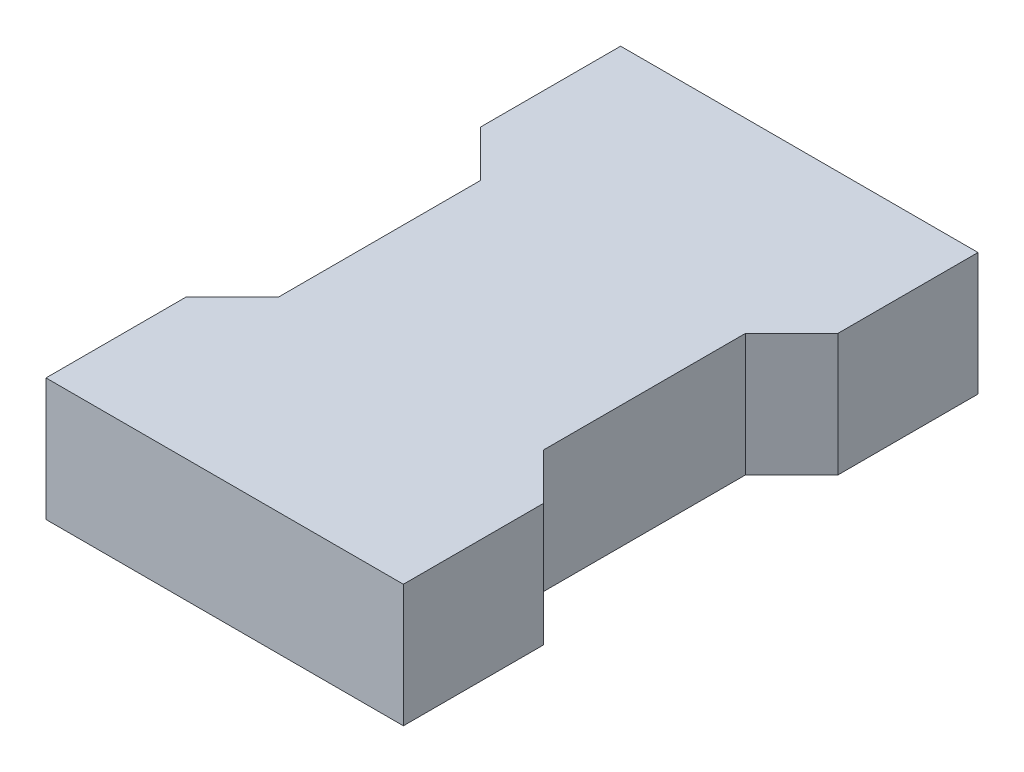
ISO-10303-21;
HEADER;
FILE_DESCRIPTION(('STEP AP214'),'2;1');
FILE_NAME('part.step','',(''),(''),'','','');
FILE_SCHEMA(('AUTOMOTIVE_DESIGN { 1 0 10303 214 1 1 1 1 }'));
ENDSEC;
DATA;
#1=APPLICATION_CONTEXT('core data for automotive mechanical design processes');
#2=APPLICATION_PROTOCOL_DEFINITION('international standard','automotive_design',2000,#1);
#3=PRODUCT_CONTEXT('',#1,'mechanical');
#4=PRODUCT('Part','Part','',(#3));
#5=PRODUCT_RELATED_PRODUCT_CATEGORY('part','',(#4));
#6=PRODUCT_DEFINITION_FORMATION('','',#4);
#7=PRODUCT_DEFINITION_CONTEXT('part definition',#1,'design');
#8=PRODUCT_DEFINITION('design','',#6,#7);
#9=PRODUCT_DEFINITION_SHAPE('','',#8);
#10=(LENGTH_UNIT() NAMED_UNIT(*) SI_UNIT(.MILLI.,.METRE.));
#11=(NAMED_UNIT(*) PLANE_ANGLE_UNIT() SI_UNIT($,.RADIAN.));
#12=(NAMED_UNIT(*) SI_UNIT($,.STERADIAN.) SOLID_ANGLE_UNIT());
#13=UNCERTAINTY_MEASURE_WITH_UNIT(LENGTH_MEASURE(1.E-05),#10,'distance_accuracy_value','');
#14=(GEOMETRIC_REPRESENTATION_CONTEXT(3) GLOBAL_UNCERTAINTY_ASSIGNED_CONTEXT((#13)) GLOBAL_UNIT_ASSIGNED_CONTEXT((#10,
#11,#12)) REPRESENTATION_CONTEXT('',''));
#15=CARTESIAN_POINT('',(0.,0.,0.));
#16=DIRECTION('',(0.,0.,1.));
#17=DIRECTION('',(1.,0.,0.));
#18=AXIS2_PLACEMENT_3D('',#15,#16,#17);
#19=CARTESIAN_POINT('',(25.5,17.5,21.));
#20=DIRECTION('',(-1.,0.,0.));
#21=DIRECTION('',(0.,0.,1.));
#22=AXIS2_PLACEMENT_3D('',#19,#20,#21);
#23=PLANE('',#22);
#24=DIRECTION('',(0.,0.,-1.));
#25=VECTOR('',#24,1.);
#26=CARTESIAN_POINT('',(25.5,0.,21.));
#27=LINE('',#26,#25);
#28=CARTESIAN_POINT('',(25.5,0.,41.));
#29=VERTEX_POINT('',#28);
#30=CARTESIAN_POINT('',(25.5,0.,21.));
#31=VERTEX_POINT('',#30);
#32=EDGE_CURVE('E155',#29,#31,#27,.T.);
#33=ORIENTED_EDGE('',*,*,#32,.T.);
#34=DIRECTION('',(0.,-1.,0.));
#35=VECTOR('',#34,1.);
#36=CARTESIAN_POINT('',(25.5,17.5,21.));
#37=LINE('',#36,#35);
#38=CARTESIAN_POINT('',(25.5,17.5,21.));
#39=VERTEX_POINT('',#38);
#40=EDGE_CURVE('E11',#39,#31,#37,.T.);
#41=ORIENTED_EDGE('',*,*,#40,.F.);
#42=DIRECTION('',(0.,0.,-1.));
#43=VECTOR('',#42,1.);
#44=CARTESIAN_POINT('',(25.5,17.5,21.));
#45=LINE('',#44,#43);
#46=CARTESIAN_POINT('',(25.5,17.5,41.));
#47=VERTEX_POINT('',#46);
#48=EDGE_CURVE('E177',#47,#39,#45,.T.);
#49=ORIENTED_EDGE('',*,*,#48,.F.);
#50=DIRECTION('',(0.,-1.,0.));
#51=VECTOR('',#50,1.);
#52=CARTESIAN_POINT('',(25.5,17.5,41.));
#53=LINE('',#52,#51);
#54=EDGE_CURVE('E151',#47,#29,#53,.T.);
#55=ORIENTED_EDGE('',*,*,#54,.T.);
#56=EDGE_LOOP('',(#33,#41,#49,#55));
#57=FACE_BOUND('',#56,.T.);
#58=ADVANCED_FACE('F35',(#57),#23,.F.);
#59=CARTESIAN_POINT('',(18.9026162790696,17.5,14.4026162790696));
#60=DIRECTION('',(-0.707106781186548,0.,0.707106781186548));
#61=DIRECTION('',(0.707106781186548,0.,0.707106781186548));
#62=AXIS2_PLACEMENT_3D('',#59,#60,#61);
#63=PLANE('',#62);
#64=DIRECTION('',(-0.707106781186548,0.,-0.707106781186548));
#65=VECTOR('',#64,1.);
#66=CARTESIAN_POINT('',(18.9026162790696,0.,14.4026162790696));
#67=LINE('',#66,#65);
#68=CARTESIAN_POINT('',(18.9026162790696,0.,14.4026162790696));
#69=VERTEX_POINT('',#68);
#70=EDGE_CURVE('E158',#31,#69,#67,.T.);
#71=ORIENTED_EDGE('',*,*,#70,.T.);
#72=DIRECTION('',(0.,-1.,0.));
#73=VECTOR('',#72,1.);
#74=CARTESIAN_POINT('',(18.9026162790696,17.5,14.4026162790696));
#75=LINE('',#74,#73);
#76=CARTESIAN_POINT('',(18.9026162790696,17.5,14.4026162790696));
#77=VERTEX_POINT('',#76);
#78=EDGE_CURVE('E43',#77,#69,#75,.T.);
#79=ORIENTED_EDGE('',*,*,#78,.F.);
#80=DIRECTION('',(-0.707106781186548,0.,-0.707106781186548));
#81=VECTOR('',#80,1.);
#82=CARTESIAN_POINT('',(18.9026162790696,17.5,14.4026162790696));
#83=LINE('',#82,#81);
#84=EDGE_CURVE('E106',#39,#77,#83,.T.);
#85=ORIENTED_EDGE('',*,*,#84,.F.);
#86=ORIENTED_EDGE('',*,*,#40,.T.);
#87=EDGE_LOOP('',(#71,#79,#85,#86));
#88=FACE_BOUND('',#87,.T.);
#89=ADVANCED_FACE('F255',(#88),#63,.F.);
#90=CARTESIAN_POINT('',(18.9026162790696,17.5,-14.4026162790696));
#91=DIRECTION('',(-1.,0.,0.));
#92=DIRECTION('',(0.,0.,1.));
#93=AXIS2_PLACEMENT_3D('',#90,#91,#92);
#94=PLANE('',#93);
#95=DIRECTION('',(0.,0.,-1.));
#96=VECTOR('',#95,1.);
#97=CARTESIAN_POINT('',(18.9026162790696,0.,-14.4026162790696));
#98=LINE('',#97,#96);
#99=CARTESIAN_POINT('',(18.9026162790696,0.,-14.4026162790696));
#100=VERTEX_POINT('',#99);
#101=EDGE_CURVE('E160',#69,#100,#98,.T.);
#102=ORIENTED_EDGE('',*,*,#101,.T.);
#103=DIRECTION('',(0.,-1.,0.));
#104=VECTOR('',#103,1.);
#105=CARTESIAN_POINT('',(18.9026162790696,17.5,-14.4026162790696));
#106=LINE('',#105,#104);
#107=CARTESIAN_POINT('',(18.9026162790696,17.5,-14.4026162790696));
#108=VERTEX_POINT('',#107);
#109=EDGE_CURVE('E196',#108,#100,#106,.T.);
#110=ORIENTED_EDGE('',*,*,#109,.F.);
#111=DIRECTION('',(0.,0.,-1.));
#112=VECTOR('',#111,1.);
#113=CARTESIAN_POINT('',(18.9026162790696,17.5,-14.4026162790696));
#114=LINE('',#113,#112);
#115=EDGE_CURVE('E204',#77,#108,#114,.T.);
#116=ORIENTED_EDGE('',*,*,#115,.F.);
#117=ORIENTED_EDGE('',*,*,#78,.T.);
#118=EDGE_LOOP('',(#102,#110,#116,#117));
#119=FACE_BOUND('',#118,.T.);
#120=ADVANCED_FACE('F202',(#119),#94,.F.);
#121=CARTESIAN_POINT('',(25.5,17.5,-21.));
#122=DIRECTION('',(-0.707106781186547,0.,-0.707106781186548));
#123=DIRECTION('',(-0.707106781186548,0.,0.707106781186547));
#124=AXIS2_PLACEMENT_3D('',#121,#122,#123);
#125=PLANE('',#124);
#126=DIRECTION('',(0.707106781186548,0.,-0.707106781186547));
#127=VECTOR('',#126,1.);
#128=CARTESIAN_POINT('',(25.5,0.,-21.));
#129=LINE('',#128,#127);
#130=CARTESIAN_POINT('',(25.5,0.,-21.));
#131=VERTEX_POINT('',#130);
#132=EDGE_CURVE('E162',#100,#131,#129,.T.);
#133=ORIENTED_EDGE('',*,*,#132,.T.);
#134=DIRECTION('',(0.,-1.,0.));
#135=VECTOR('',#134,1.);
#136=CARTESIAN_POINT('',(25.5,17.5,-21.));
#137=LINE('',#136,#135);
#138=CARTESIAN_POINT('',(25.5,17.5,-21.));
#139=VERTEX_POINT('',#138);
#140=EDGE_CURVE('E193',#139,#131,#137,.T.);
#141=ORIENTED_EDGE('',*,*,#140,.F.);
#142=DIRECTION('',(0.707106781186548,0.,-0.707106781186547));
#143=VECTOR('',#142,1.);
#144=CARTESIAN_POINT('',(25.5,17.5,-21.));
#145=LINE('',#144,#143);
#146=EDGE_CURVE('E222',#108,#139,#145,.T.);
#147=ORIENTED_EDGE('',*,*,#146,.F.);
#148=ORIENTED_EDGE('',*,*,#109,.T.);
#149=EDGE_LOOP('',(#133,#141,#147,#148));
#150=FACE_BOUND('',#149,.T.);
#151=ADVANCED_FACE('F213',(#150),#125,.F.);
#152=CARTESIAN_POINT('',(25.5,17.5,-41.));
#153=DIRECTION('',(-1.,0.,0.));
#154=DIRECTION('',(0.,0.,1.));
#155=AXIS2_PLACEMENT_3D('',#152,#153,#154);
#156=PLANE('',#155);
#157=DIRECTION('',(0.,0.,-1.));
#158=VECTOR('',#157,1.);
#159=CARTESIAN_POINT('',(25.5,0.,-41.));
#160=LINE('',#159,#158);
#161=CARTESIAN_POINT('',(25.5,0.,-41.));
#162=VERTEX_POINT('',#161);
#163=EDGE_CURVE('E164',#131,#162,#160,.T.);
#164=ORIENTED_EDGE('',*,*,#163,.T.);
#165=DIRECTION('',(0.,-1.,0.));
#166=VECTOR('',#165,1.);
#167=CARTESIAN_POINT('',(25.5,17.5,-41.));
#168=LINE('',#167,#166);
#169=CARTESIAN_POINT('',(25.5,17.5,-41.));
#170=VERTEX_POINT('',#169);
#171=EDGE_CURVE('E190',#170,#162,#168,.T.);
#172=ORIENTED_EDGE('',*,*,#171,.F.);
#173=DIRECTION('',(0.,0.,-1.));
#174=VECTOR('',#173,1.);
#175=CARTESIAN_POINT('',(25.5,17.5,-41.));
#176=LINE('',#175,#174);
#177=EDGE_CURVE('E219',#139,#170,#176,.T.);
#178=ORIENTED_EDGE('',*,*,#177,.F.);
#179=ORIENTED_EDGE('',*,*,#140,.T.);
#180=EDGE_LOOP('',(#164,#172,#178,#179));
#181=FACE_BOUND('',#180,.T.);
#182=ADVANCED_FACE('F217',(#181),#156,.F.);
#183=CARTESIAN_POINT('',(-25.5,17.5,-41.));
#184=DIRECTION('',(0.,0.,1.));
#185=DIRECTION('',(1.,0.,0.));
#186=AXIS2_PLACEMENT_3D('',#183,#184,#185);
#187=PLANE('',#186);
#188=DIRECTION('',(-1.,0.,0.));
#189=VECTOR('',#188,1.);
#190=CARTESIAN_POINT('',(-25.5,0.,-41.));
#191=LINE('',#190,#189);
#192=CARTESIAN_POINT('',(-25.5,0.,-41.));
#193=VERTEX_POINT('',#192);
#194=EDGE_CURVE('E166',#162,#193,#191,.T.);
#195=ORIENTED_EDGE('',*,*,#194,.T.);
#196=DIRECTION('',(0.,-1.,0.));
#197=VECTOR('',#196,1.);
#198=CARTESIAN_POINT('',(-25.5,17.5,-41.));
#199=LINE('',#198,#197);
#200=CARTESIAN_POINT('',(-25.5,17.5,-41.));
#201=VERTEX_POINT('',#200);
#202=EDGE_CURVE('E187',#201,#193,#199,.T.);
#203=ORIENTED_EDGE('',*,*,#202,.F.);
#204=DIRECTION('',(-1.,0.,0.));
#205=VECTOR('',#204,1.);
#206=CARTESIAN_POINT('',(-25.5,17.5,-41.));
#207=LINE('',#206,#205);
#208=EDGE_CURVE('E221',#170,#201,#207,.T.);
#209=ORIENTED_EDGE('',*,*,#208,.F.);
#210=ORIENTED_EDGE('',*,*,#171,.T.);
#211=EDGE_LOOP('',(#195,#203,#209,#210));
#212=FACE_BOUND('',#211,.T.);
#213=ADVANCED_FACE('F268',(#212),#187,.F.);
#214=CARTESIAN_POINT('',(-25.5,17.5,-41.));
#215=DIRECTION('',(1.,0.,0.));
#216=DIRECTION('',(0.,0.,-1.));
#217=AXIS2_PLACEMENT_3D('',#214,#215,#216);
#218=PLANE('',#217);
#219=DIRECTION('',(0.,0.,1.));
#220=VECTOR('',#219,1.);
#221=CARTESIAN_POINT('',(-25.5,0.,-41.));
#222=LINE('',#221,#220);
#223=CARTESIAN_POINT('',(-25.5,0.,-21.));
#224=VERTEX_POINT('',#223);
#225=EDGE_CURVE('E168',#193,#224,#222,.T.);
#226=ORIENTED_EDGE('',*,*,#225,.T.);
#227=DIRECTION('',(0.,-1.,0.));
#228=VECTOR('',#227,1.);
#229=CARTESIAN_POINT('',(-25.5,17.5,-21.));
#230=LINE('',#229,#228);
#231=CARTESIAN_POINT('',(-25.5,17.5,-21.));
#232=VERTEX_POINT('',#231);
#233=EDGE_CURVE('E184',#232,#224,#230,.T.);
#234=ORIENTED_EDGE('',*,*,#233,.F.);
#235=DIRECTION('',(0.,0.,1.));
#236=VECTOR('',#235,1.);
#237=CARTESIAN_POINT('',(-25.5,17.5,-41.));
#238=LINE('',#237,#236);
#239=EDGE_CURVE('E224',#201,#232,#238,.T.);
#240=ORIENTED_EDGE('',*,*,#239,.F.);
#241=ORIENTED_EDGE('',*,*,#202,.T.);
#242=EDGE_LOOP('',(#226,#234,#240,#241));
#243=FACE_BOUND('',#242,.T.);
#244=ADVANCED_FACE('F271',(#243),#218,.F.);
#245=CARTESIAN_POINT('',(-25.5,17.5,-21.));
#246=DIRECTION('',(0.707106781186547,0.,-0.707106781186548));
#247=DIRECTION('',(-0.707106781186548,0.,-0.707106781186547));
#248=AXIS2_PLACEMENT_3D('',#245,#246,#247);
#249=PLANE('',#248);
#250=DIRECTION('',(0.707106781186548,0.,0.707106781186547));
#251=VECTOR('',#250,1.);
#252=CARTESIAN_POINT('',(-25.5,0.,-21.));
#253=LINE('',#252,#251);
#254=CARTESIAN_POINT('',(-18.9026162790696,0.,-14.4026162790696));
#255=VERTEX_POINT('',#254);
#256=EDGE_CURVE('E170',#224,#255,#253,.T.);
#257=ORIENTED_EDGE('',*,*,#256,.T.);
#258=DIRECTION('',(0.,-1.,0.));
#259=VECTOR('',#258,1.);
#260=CARTESIAN_POINT('',(-18.9026162790696,17.5,-14.4026162790696));
#261=LINE('',#260,#259);
#262=CARTESIAN_POINT('',(-18.9026162790696,17.5,-14.4026162790696));
#263=VERTEX_POINT('',#262);
#264=EDGE_CURVE('E181',#263,#255,#261,.T.);
#265=ORIENTED_EDGE('',*,*,#264,.F.);
#266=DIRECTION('',(0.707106781186548,0.,0.707106781186547));
#267=VECTOR('',#266,1.);
#268=CARTESIAN_POINT('',(-25.5,17.5,-21.));
#269=LINE('',#268,#267);
#270=EDGE_CURVE('E230',#232,#263,#269,.T.);
#271=ORIENTED_EDGE('',*,*,#270,.F.);
#272=ORIENTED_EDGE('',*,*,#233,.T.);
#273=EDGE_LOOP('',(#257,#265,#271,#272));
#274=FACE_BOUND('',#273,.T.);
#275=ADVANCED_FACE('F236',(#274),#249,.F.);
#276=CARTESIAN_POINT('',(-18.9026162790696,17.5,-14.4026162790696));
#277=DIRECTION('',(1.,0.,0.));
#278=DIRECTION('',(0.,0.,-1.));
#279=AXIS2_PLACEMENT_3D('',#276,#277,#278);
#280=PLANE('',#279);
#281=DIRECTION('',(0.,0.,1.));
#282=VECTOR('',#281,1.);
#283=CARTESIAN_POINT('',(-18.9026162790696,0.,-14.4026162790696));
#284=LINE('',#283,#282);
#285=CARTESIAN_POINT('',(-18.9026162790696,0.,14.4026162790696));
#286=VERTEX_POINT('',#285);
#287=EDGE_CURVE('E172',#255,#286,#284,.T.);
#288=ORIENTED_EDGE('',*,*,#287,.T.);
#289=DIRECTION('',(0.,-1.,0.));
#290=VECTOR('',#289,1.);
#291=CARTESIAN_POINT('',(-18.9026162790696,17.5,14.4026162790696));
#292=LINE('',#291,#290);
#293=CARTESIAN_POINT('',(-18.9026162790696,17.5,14.4026162790696));
#294=VERTEX_POINT('',#293);
#295=EDGE_CURVE('E146',#294,#286,#292,.T.);
#296=ORIENTED_EDGE('',*,*,#295,.F.);
#297=DIRECTION('',(0.,0.,1.));
#298=VECTOR('',#297,1.);
#299=CARTESIAN_POINT('',(-18.9026162790696,17.5,-14.4026162790696));
#300=LINE('',#299,#298);
#301=EDGE_CURVE('E137',#263,#294,#300,.T.);
#302=ORIENTED_EDGE('',*,*,#301,.F.);
#303=ORIENTED_EDGE('',*,*,#264,.T.);
#304=EDGE_LOOP('',(#288,#296,#302,#303));
#305=FACE_BOUND('',#304,.T.);
#306=ADVANCED_FACE('F240',(#305),#280,.F.);
#307=CARTESIAN_POINT('',(-18.9026162790696,17.5,14.4026162790696));
#308=DIRECTION('',(0.707106781186548,0.,0.707106781186548));
#309=DIRECTION('',(0.707106781186548,0.,-0.707106781186548));
#310=AXIS2_PLACEMENT_3D('',#307,#308,#309);
#311=PLANE('',#310);
#312=DIRECTION('',(-0.707106781186548,0.,0.707106781186548));
#313=VECTOR('',#312,1.);
#314=CARTESIAN_POINT('',(-18.9026162790696,0.,14.4026162790696));
#315=LINE('',#314,#313);
#316=CARTESIAN_POINT('',(-25.5,0.,21.));
#317=VERTEX_POINT('',#316);
#318=EDGE_CURVE('E145',#286,#317,#315,.T.);
#319=ORIENTED_EDGE('',*,*,#318,.T.);
#320=DIRECTION('',(0.,-1.,0.));
#321=VECTOR('',#320,1.);
#322=CARTESIAN_POINT('',(-25.5,17.5,21.));
#323=LINE('',#322,#321);
#324=CARTESIAN_POINT('',(-25.5,17.5,21.));
#325=VERTEX_POINT('',#324);
#326=EDGE_CURVE('E142',#325,#317,#323,.T.);
#327=ORIENTED_EDGE('',*,*,#326,.F.);
#328=DIRECTION('',(-0.707106781186548,0.,0.707106781186548));
#329=VECTOR('',#328,1.);
#330=CARTESIAN_POINT('',(-18.9026162790696,17.5,14.4026162790696));
#331=LINE('',#330,#329);
#332=EDGE_CURVE('E131',#294,#325,#331,.T.);
#333=ORIENTED_EDGE('',*,*,#332,.F.);
#334=ORIENTED_EDGE('',*,*,#295,.T.);
#335=EDGE_LOOP('',(#319,#327,#333,#334));
#336=FACE_BOUND('',#335,.T.);
#337=ADVANCED_FACE('F143',(#336),#311,.F.);
#338=CARTESIAN_POINT('',(-25.5,17.5,21.));
#339=DIRECTION('',(1.,0.,0.));
#340=DIRECTION('',(0.,0.,-1.));
#341=AXIS2_PLACEMENT_3D('',#338,#339,#340);
#342=PLANE('',#341);
#343=DIRECTION('',(0.,0.,1.));
#344=VECTOR('',#343,1.);
#345=CARTESIAN_POINT('',(-25.5,0.,21.));
#346=LINE('',#345,#344);
#347=CARTESIAN_POINT('',(-25.5,0.,41.));
#348=VERTEX_POINT('',#347);
#349=EDGE_CURVE('E92',#317,#348,#346,.T.);
#350=ORIENTED_EDGE('',*,*,#349,.T.);
#351=DIRECTION('',(0.,-1.,0.));
#352=VECTOR('',#351,1.);
#353=CARTESIAN_POINT('',(-25.5,17.5,41.));
#354=LINE('',#353,#352);
#355=CARTESIAN_POINT('',(-25.5,17.5,41.));
#356=VERTEX_POINT('',#355);
#357=EDGE_CURVE('E147',#356,#348,#354,.T.);
#358=ORIENTED_EDGE('',*,*,#357,.F.);
#359=DIRECTION('',(0.,0.,1.));
#360=VECTOR('',#359,1.);
#361=CARTESIAN_POINT('',(-25.5,17.5,21.));
#362=LINE('',#361,#360);
#363=EDGE_CURVE('E135',#325,#356,#362,.T.);
#364=ORIENTED_EDGE('',*,*,#363,.F.);
#365=ORIENTED_EDGE('',*,*,#326,.T.);
#366=EDGE_LOOP('',(#350,#358,#364,#365));
#367=FACE_BOUND('',#366,.T.);
#368=ADVANCED_FACE('F149',(#367),#342,.F.);
#369=CARTESIAN_POINT('',(-25.5,17.5,41.));
#370=DIRECTION('',(0.,0.,-1.));
#371=DIRECTION('',(-1.,0.,0.));
#372=AXIS2_PLACEMENT_3D('',#369,#370,#371);
#373=PLANE('',#372);
#374=DIRECTION('',(1.,0.,0.));
#375=VECTOR('',#374,1.);
#376=CARTESIAN_POINT('',(-25.5,0.,41.));
#377=LINE('',#376,#375);
#378=EDGE_CURVE('E98',#348,#29,#377,.T.);
#379=ORIENTED_EDGE('',*,*,#378,.T.);
#380=ORIENTED_EDGE('',*,*,#54,.F.);
#381=DIRECTION('',(1.,0.,0.));
#382=VECTOR('',#381,1.);
#383=CARTESIAN_POINT('',(-25.5,17.5,41.));
#384=LINE('',#383,#382);
#385=EDGE_CURVE('E51',#356,#47,#384,.T.);
#386=ORIENTED_EDGE('',*,*,#385,.F.);
#387=ORIENTED_EDGE('',*,*,#357,.T.);
#388=EDGE_LOOP('',(#379,#380,#386,#387));
#389=FACE_BOUND('',#388,.T.);
#390=ADVANCED_FACE('F244',(#389),#373,.F.);
#391=CARTESIAN_POINT('',(0.,17.5,0.));
#392=DIRECTION('',(0.,1.,0.));
#393=DIRECTION('',(0.,0.,1.));
#394=AXIS2_PLACEMENT_3D('',#391,#392,#393);
#395=PLANE('',#394);
#396=ORIENTED_EDGE('',*,*,#48,.T.);
#397=ORIENTED_EDGE('',*,*,#84,.T.);
#398=ORIENTED_EDGE('',*,*,#115,.T.);
#399=ORIENTED_EDGE('',*,*,#146,.T.);
#400=ORIENTED_EDGE('',*,*,#177,.T.);
#401=ORIENTED_EDGE('',*,*,#208,.T.);
#402=ORIENTED_EDGE('',*,*,#239,.T.);
#403=ORIENTED_EDGE('',*,*,#270,.T.);
#404=ORIENTED_EDGE('',*,*,#301,.T.);
#405=ORIENTED_EDGE('',*,*,#332,.T.);
#406=ORIENTED_EDGE('',*,*,#363,.T.);
#407=ORIENTED_EDGE('',*,*,#385,.T.);
#408=EDGE_LOOP('',(#396,#397,#398,#399,#400,#401,#402,#403,#404,#405,#406,#407));
#409=FACE_BOUND('',#408,.T.);
#410=ADVANCED_FACE('F133',(#409),#395,.T.);
#411=CARTESIAN_POINT('',(0.,0.,0.));
#412=DIRECTION('',(0.,1.,0.));
#413=DIRECTION('',(0.,0.,1.));
#414=AXIS2_PLACEMENT_3D('',#411,#412,#413);
#415=PLANE('',#414);
#416=ORIENTED_EDGE('',*,*,#32,.F.);
#417=ORIENTED_EDGE('',*,*,#378,.F.);
#418=ORIENTED_EDGE('',*,*,#349,.F.);
#419=ORIENTED_EDGE('',*,*,#318,.F.);
#420=ORIENTED_EDGE('',*,*,#287,.F.);
#421=ORIENTED_EDGE('',*,*,#256,.F.);
#422=ORIENTED_EDGE('',*,*,#225,.F.);
#423=ORIENTED_EDGE('',*,*,#194,.F.);
#424=ORIENTED_EDGE('',*,*,#163,.F.);
#425=ORIENTED_EDGE('',*,*,#132,.F.);
#426=ORIENTED_EDGE('',*,*,#101,.F.);
#427=ORIENTED_EDGE('',*,*,#70,.F.);
#428=EDGE_LOOP('',(#416,#417,#418,#419,#420,#421,#422,#423,#424,#425,#426,#427));
#429=FACE_BOUND('',#428,.T.);
#430=ADVANCED_FACE('F208',(#429),#415,.F.);
#431=CLOSED_SHELL('',(#58,#89,#120,#151,#182,#213,#244,#275,#306,#337,#368,#390,#410,#430));
#432=MANIFOLD_SOLID_BREP('B2',#431);
#433=ADVANCED_BREP_SHAPE_REPRESENTATION('',(#18,#432),#14);
#434=SHAPE_DEFINITION_REPRESENTATION(#9,#433);
ENDSEC;
END-ISO-10303-21;
